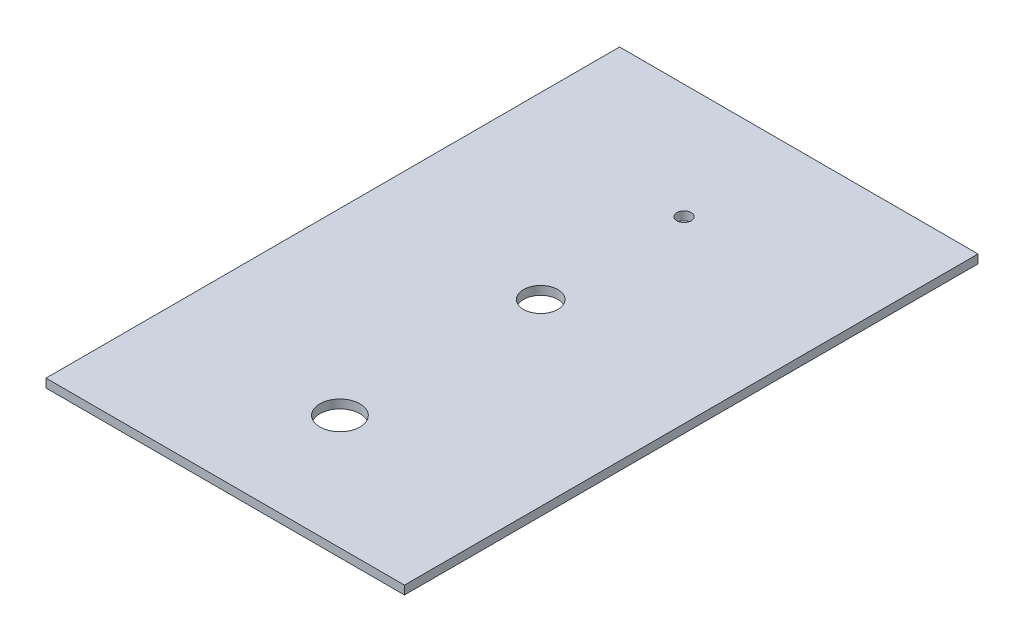
ISO-10303-21;
HEADER;
FILE_DESCRIPTION(('STEP AP214'),'2;1');
FILE_NAME('part.step','',(''),(''),'','','');
FILE_SCHEMA(('AUTOMOTIVE_DESIGN { 1 0 10303 214 1 1 1 1 }'));
ENDSEC;
DATA;
#1=APPLICATION_CONTEXT('core data for automotive mechanical design processes');
#2=APPLICATION_PROTOCOL_DEFINITION('international standard','automotive_design',2000,#1);
#3=PRODUCT_CONTEXT('',#1,'mechanical');
#4=PRODUCT('Part','Part','',(#3));
#5=PRODUCT_RELATED_PRODUCT_CATEGORY('part','',(#4));
#6=PRODUCT_DEFINITION_FORMATION('','',#4);
#7=PRODUCT_DEFINITION_CONTEXT('part definition',#1,'design');
#8=PRODUCT_DEFINITION('design','',#6,#7);
#9=PRODUCT_DEFINITION_SHAPE('','',#8);
#10=(LENGTH_UNIT() NAMED_UNIT(*) SI_UNIT(.MILLI.,.METRE.));
#11=(NAMED_UNIT(*) PLANE_ANGLE_UNIT() SI_UNIT($,.RADIAN.));
#12=(NAMED_UNIT(*) SI_UNIT($,.STERADIAN.) SOLID_ANGLE_UNIT());
#13=UNCERTAINTY_MEASURE_WITH_UNIT(LENGTH_MEASURE(1.E-05),#10,'distance_accuracy_value','');
#14=(GEOMETRIC_REPRESENTATION_CONTEXT(3) GLOBAL_UNCERTAINTY_ASSIGNED_CONTEXT((#13)) GLOBAL_UNIT_ASSIGNED_CONTEXT((#10,
#11,#12)) REPRESENTATION_CONTEXT('',''));
#15=CARTESIAN_POINT('',(0.,0.,0.));
#16=DIRECTION('',(0.,0.,1.));
#17=DIRECTION('',(1.,0.,0.));
#18=AXIS2_PLACEMENT_3D('',#15,#16,#17);
#19=CARTESIAN_POINT('',(62.5,3.,100.));
#20=DIRECTION('',(-1.,0.,0.));
#21=DIRECTION('',(0.,0.,1.));
#22=AXIS2_PLACEMENT_3D('',#19,#20,#21);
#23=PLANE('',#22);
#24=DIRECTION('',(0.,0.,-1.));
#25=VECTOR('',#24,1.);
#26=CARTESIAN_POINT('',(62.5,0.,100.));
#27=LINE('',#26,#25);
#28=CARTESIAN_POINT('',(62.5,0.,100.));
#29=VERTEX_POINT('',#28);
#30=CARTESIAN_POINT('',(62.5,0.,-100.));
#31=VERTEX_POINT('',#30);
#32=EDGE_CURVE('E106',#29,#31,#27,.T.);
#33=ORIENTED_EDGE('',*,*,#32,.T.);
#34=DIRECTION('',(0.,-1.,0.));
#35=VECTOR('',#34,1.);
#36=CARTESIAN_POINT('',(62.5,3.,-100.));
#37=LINE('',#36,#35);
#38=CARTESIAN_POINT('',(62.5,3.,-100.));
#39=VERTEX_POINT('',#38);
#40=EDGE_CURVE('E11',#39,#31,#37,.T.);
#41=ORIENTED_EDGE('',*,*,#40,.F.);
#42=DIRECTION('',(0.,0.,-1.));
#43=VECTOR('',#42,1.);
#44=CARTESIAN_POINT('',(62.5,3.,100.));
#45=LINE('',#44,#43);
#46=CARTESIAN_POINT('',(62.5,3.,100.));
#47=VERTEX_POINT('',#46);
#48=EDGE_CURVE('E90',#47,#39,#45,.T.);
#49=ORIENTED_EDGE('',*,*,#48,.F.);
#50=DIRECTION('',(0.,-1.,0.));
#51=VECTOR('',#50,1.);
#52=CARTESIAN_POINT('',(62.5,3.,100.));
#53=LINE('',#52,#51);
#54=EDGE_CURVE('E102',#47,#29,#53,.T.);
#55=ORIENTED_EDGE('',*,*,#54,.T.);
#56=EDGE_LOOP('',(#33,#41,#49,#55));
#57=FACE_BOUND('',#56,.T.);
#58=ADVANCED_FACE('F38',(#57),#23,.F.);
#59=CARTESIAN_POINT('',(-62.5,3.,-100.));
#60=DIRECTION('',(0.,0.,1.));
#61=DIRECTION('',(1.,0.,0.));
#62=AXIS2_PLACEMENT_3D('',#59,#60,#61);
#63=PLANE('',#62);
#64=DIRECTION('',(-1.,0.,0.));
#65=VECTOR('',#64,1.);
#66=CARTESIAN_POINT('',(-62.5,0.,-100.));
#67=LINE('',#66,#65);
#68=CARTESIAN_POINT('',(-62.5,0.,-100.));
#69=VERTEX_POINT('',#68);
#70=EDGE_CURVE('E95',#31,#69,#67,.T.);
#71=ORIENTED_EDGE('',*,*,#70,.T.);
#72=DIRECTION('',(0.,-1.,0.));
#73=VECTOR('',#72,1.);
#74=CARTESIAN_POINT('',(-62.5,3.,-100.));
#75=LINE('',#74,#73);
#76=CARTESIAN_POINT('',(-62.5,3.,-100.));
#77=VERTEX_POINT('',#76);
#78=EDGE_CURVE('E47',#77,#69,#75,.T.);
#79=ORIENTED_EDGE('',*,*,#78,.F.);
#80=DIRECTION('',(-1.,0.,0.));
#81=VECTOR('',#80,1.);
#82=CARTESIAN_POINT('',(-62.5,3.,-100.));
#83=LINE('',#82,#81);
#84=EDGE_CURVE('E85',#39,#77,#83,.T.);
#85=ORIENTED_EDGE('',*,*,#84,.F.);
#86=ORIENTED_EDGE('',*,*,#40,.T.);
#87=EDGE_LOOP('',(#71,#79,#85,#86));
#88=FACE_BOUND('',#87,.T.);
#89=ADVANCED_FACE('F94',(#88),#63,.F.);
#90=CARTESIAN_POINT('',(-62.5,3.,100.));
#91=DIRECTION('',(1.,0.,0.));
#92=DIRECTION('',(0.,0.,-1.));
#93=AXIS2_PLACEMENT_3D('',#90,#91,#92);
#94=PLANE('',#93);
#95=DIRECTION('',(0.,0.,1.));
#96=VECTOR('',#95,1.);
#97=CARTESIAN_POINT('',(-62.5,0.,100.));
#98=LINE('',#97,#96);
#99=CARTESIAN_POINT('',(-62.5,0.,100.));
#100=VERTEX_POINT('',#99);
#101=EDGE_CURVE('E72',#69,#100,#98,.T.);
#102=ORIENTED_EDGE('',*,*,#101,.T.);
#103=DIRECTION('',(0.,-1.,0.));
#104=VECTOR('',#103,1.);
#105=CARTESIAN_POINT('',(-62.5,3.,100.));
#106=LINE('',#105,#104);
#107=CARTESIAN_POINT('',(-62.5,3.,100.));
#108=VERTEX_POINT('',#107);
#109=EDGE_CURVE('E97',#108,#100,#106,.T.);
#110=ORIENTED_EDGE('',*,*,#109,.F.);
#111=DIRECTION('',(0.,0.,1.));
#112=VECTOR('',#111,1.);
#113=CARTESIAN_POINT('',(-62.5,3.,100.));
#114=LINE('',#113,#112);
#115=EDGE_CURVE('E88',#77,#108,#114,.T.);
#116=ORIENTED_EDGE('',*,*,#115,.F.);
#117=ORIENTED_EDGE('',*,*,#78,.T.);
#118=EDGE_LOOP('',(#102,#110,#116,#117));
#119=FACE_BOUND('',#118,.T.);
#120=ADVANCED_FACE('F98',(#119),#94,.F.);
#121=CARTESIAN_POINT('',(-62.5,3.,100.));
#122=DIRECTION('',(0.,0.,-1.));
#123=DIRECTION('',(-1.,0.,0.));
#124=AXIS2_PLACEMENT_3D('',#121,#122,#123);
#125=PLANE('',#124);
#126=DIRECTION('',(1.,0.,0.));
#127=VECTOR('',#126,1.);
#128=CARTESIAN_POINT('',(-62.5,0.,100.));
#129=LINE('',#128,#127);
#130=EDGE_CURVE('E78',#100,#29,#129,.T.);
#131=ORIENTED_EDGE('',*,*,#130,.T.);
#132=ORIENTED_EDGE('',*,*,#54,.F.);
#133=DIRECTION('',(1.,0.,0.));
#134=VECTOR('',#133,1.);
#135=CARTESIAN_POINT('',(-62.5,3.,100.));
#136=LINE('',#135,#134);
#137=EDGE_CURVE('E55',#108,#47,#136,.T.);
#138=ORIENTED_EDGE('',*,*,#137,.F.);
#139=ORIENTED_EDGE('',*,*,#109,.T.);
#140=EDGE_LOOP('',(#131,#132,#138,#139));
#141=FACE_BOUND('',#140,.T.);
#142=ADVANCED_FACE('F120',(#141),#125,.F.);
#143=CARTESIAN_POINT('',(0.,3.,0.));
#144=DIRECTION('',(0.,-1.,0.));
#145=DIRECTION('',(0.,0.,-1.));
#146=AXIS2_PLACEMENT_3D('',#143,#144,#145);
#147=PLANE('',#146);
#148=CARTESIAN_POINT('',(0.,3.,-60.));
#149=DIRECTION('',(0.,1.,0.));
#150=DIRECTION('',(0.,0.,1.));
#151=AXIS2_PLACEMENT_3D('',#148,#149,#150);
#152=CIRCLE('',#151,2.5);
#153=CARTESIAN_POINT('',(0.,3.,-57.5));
#154=VERTEX_POINT('',#153);
#155=EDGE_CURVE('E110',#154,#154,#152,.T.);
#156=ORIENTED_EDGE('',*,*,#155,.F.);
#157=EDGE_LOOP('',(#156));
#158=FACE_BOUND('',#157,.T.);
#159=CARTESIAN_POINT('',(0.,3.,60.));
#160=DIRECTION('',(0.,1.,0.));
#161=DIRECTION('',(0.,0.,1.));
#162=AXIS2_PLACEMENT_3D('',#159,#160,#161);
#163=CIRCLE('',#162,7.);
#164=CARTESIAN_POINT('',(0.,3.,67.));
#165=VERTEX_POINT('',#164);
#166=EDGE_CURVE('E139',#165,#165,#163,.T.);
#167=ORIENTED_EDGE('',*,*,#166,.F.);
#168=EDGE_LOOP('',(#167));
#169=FACE_BOUND('',#168,.T.);
#170=CARTESIAN_POINT('',(0.,3.,-10.));
#171=DIRECTION('',(0.,1.,0.));
#172=DIRECTION('',(0.,0.,1.));
#173=AXIS2_PLACEMENT_3D('',#170,#171,#172);
#174=CIRCLE('',#173,6.);
#175=CARTESIAN_POINT('',(0.,3.,-4.));
#176=VERTEX_POINT('',#175);
#177=EDGE_CURVE('E131',#176,#176,#174,.T.);
#178=ORIENTED_EDGE('',*,*,#177,.F.);
#179=EDGE_LOOP('',(#178));
#180=FACE_BOUND('',#179,.T.);
#181=ORIENTED_EDGE('',*,*,#48,.T.);
#182=ORIENTED_EDGE('',*,*,#84,.T.);
#183=ORIENTED_EDGE('',*,*,#115,.T.);
#184=ORIENTED_EDGE('',*,*,#137,.T.);
#185=EDGE_LOOP('',(#181,#182,#183,#184));
#186=FACE_BOUND('',#185,.T.);
#187=ADVANCED_FACE('F86',(#158,#169,#180,#186),#147,.F.);
#188=CARTESIAN_POINT('',(0.,0.,0.));
#189=DIRECTION('',(0.,-1.,0.));
#190=DIRECTION('',(0.,0.,-1.));
#191=AXIS2_PLACEMENT_3D('',#188,#189,#190);
#192=PLANE('',#191);
#193=CARTESIAN_POINT('',(0.,0.,-60.));
#194=DIRECTION('',(0.,-1.,0.));
#195=DIRECTION('',(0.,0.,-1.));
#196=AXIS2_PLACEMENT_3D('',#193,#194,#195);
#197=CIRCLE('',#196,2.5);
#198=CARTESIAN_POINT('',(0.,0.,-57.5));
#199=VERTEX_POINT('',#198);
#200=EDGE_CURVE('E143',#199,#199,#197,.F.);
#201=ORIENTED_EDGE('',*,*,#200,.T.);
#202=EDGE_LOOP('',(#201));
#203=FACE_BOUND('',#202,.T.);
#204=CARTESIAN_POINT('',(0.,0.,60.));
#205=DIRECTION('',(0.,-1.,0.));
#206=DIRECTION('',(0.,0.,-1.));
#207=AXIS2_PLACEMENT_3D('',#204,#205,#206);
#208=CIRCLE('',#207,7.);
#209=CARTESIAN_POINT('',(0.,0.,67.));
#210=VERTEX_POINT('',#209);
#211=EDGE_CURVE('E135',#210,#210,#208,.F.);
#212=ORIENTED_EDGE('',*,*,#211,.T.);
#213=EDGE_LOOP('',(#212));
#214=FACE_BOUND('',#213,.T.);
#215=CARTESIAN_POINT('',(0.,0.,-10.));
#216=DIRECTION('',(0.,-1.,0.));
#217=DIRECTION('',(0.,0.,-1.));
#218=AXIS2_PLACEMENT_3D('',#215,#216,#217);
#219=CIRCLE('',#218,6.);
#220=CARTESIAN_POINT('',(0.,0.,-4.));
#221=VERTEX_POINT('',#220);
#222=EDGE_CURVE('E127',#221,#221,#219,.F.);
#223=ORIENTED_EDGE('',*,*,#222,.T.);
#224=EDGE_LOOP('',(#223));
#225=FACE_BOUND('',#224,.T.);
#226=ORIENTED_EDGE('',*,*,#32,.F.);
#227=ORIENTED_EDGE('',*,*,#130,.F.);
#228=ORIENTED_EDGE('',*,*,#101,.F.);
#229=ORIENTED_EDGE('',*,*,#70,.F.);
#230=EDGE_LOOP('',(#226,#227,#228,#229));
#231=FACE_BOUND('',#230,.T.);
#232=ADVANCED_FACE('F123',(#203,#214,#225,#231),#192,.T.);
#233=CARTESIAN_POINT('',(0.,-0.00100000000000013,-10.));
#234=DIRECTION('',(0.,1.,0.));
#235=DIRECTION('',(0.,0.,1.));
#236=AXIS2_PLACEMENT_3D('',#233,#234,#235);
#237=CYLINDRICAL_SURFACE('',#236,6.);
#238=CARTESIAN_POINT('',(0.,0.,-4.));
#239=CARTESIAN_POINT('',(0.,0.03125,-4.));
#240=CARTESIAN_POINT('',(0.,0.0625,-4.));
#241=CARTESIAN_POINT('',(0.,0.125,-4.));
#242=CARTESIAN_POINT('',(0.,0.15625,-4.));
#243=CARTESIAN_POINT('',(0.,0.21875,-4.));
#244=CARTESIAN_POINT('',(0.,0.25,-4.));
#245=CARTESIAN_POINT('',(0.,0.3125,-4.));
#246=CARTESIAN_POINT('',(0.,0.34375,-4.));
#247=CARTESIAN_POINT('',(0.,0.40625,-4.));
#248=CARTESIAN_POINT('',(0.,0.4375,-4.));
#249=CARTESIAN_POINT('',(0.,0.5,-4.));
#250=CARTESIAN_POINT('',(0.,0.53125,-4.));
#251=CARTESIAN_POINT('',(0.,0.59375,-4.));
#252=CARTESIAN_POINT('',(0.,0.625,-4.));
#253=CARTESIAN_POINT('',(0.,0.6875,-4.));
#254=CARTESIAN_POINT('',(0.,0.71875,-4.));
#255=CARTESIAN_POINT('',(0.,0.78125,-4.));
#256=CARTESIAN_POINT('',(0.,0.8125,-4.));
#257=CARTESIAN_POINT('',(0.,0.875,-4.));
#258=CARTESIAN_POINT('',(0.,0.90625,-4.));
#259=CARTESIAN_POINT('',(0.,0.96875,-4.));
#260=CARTESIAN_POINT('',(0.,1.,-4.));
#261=CARTESIAN_POINT('',(0.,1.0625,-4.));
#262=CARTESIAN_POINT('',(0.,1.09375,-4.));
#263=CARTESIAN_POINT('',(0.,1.15625,-4.));
#264=CARTESIAN_POINT('',(0.,1.1875,-4.));
#265=CARTESIAN_POINT('',(0.,1.25,-4.));
#266=CARTESIAN_POINT('',(0.,1.28125,-4.));
#267=CARTESIAN_POINT('',(0.,1.34375,-4.));
#268=CARTESIAN_POINT('',(0.,1.375,-4.));
#269=CARTESIAN_POINT('',(0.,1.4375,-4.));
#270=CARTESIAN_POINT('',(0.,1.46875,-4.));
#271=CARTESIAN_POINT('',(0.,1.53125,-4.));
#272=CARTESIAN_POINT('',(0.,1.5625,-4.));
#273=CARTESIAN_POINT('',(0.,1.625,-4.));
#274=CARTESIAN_POINT('',(0.,1.65625,-4.));
#275=CARTESIAN_POINT('',(0.,1.71875,-4.));
#276=CARTESIAN_POINT('',(0.,1.75,-4.));
#277=CARTESIAN_POINT('',(0.,1.8125,-4.));
#278=CARTESIAN_POINT('',(0.,1.84375,-4.));
#279=CARTESIAN_POINT('',(0.,1.90625,-4.));
#280=CARTESIAN_POINT('',(0.,1.9375,-4.));
#281=CARTESIAN_POINT('',(0.,2.,-4.));
#282=CARTESIAN_POINT('',(0.,2.03125,-4.));
#283=CARTESIAN_POINT('',(0.,2.09375,-4.));
#284=CARTESIAN_POINT('',(0.,2.125,-4.));
#285=CARTESIAN_POINT('',(0.,2.1875,-4.));
#286=CARTESIAN_POINT('',(0.,2.21875,-4.));
#287=CARTESIAN_POINT('',(0.,2.28125,-4.));
#288=CARTESIAN_POINT('',(0.,2.3125,-4.));
#289=CARTESIAN_POINT('',(0.,2.375,-4.));
#290=CARTESIAN_POINT('',(0.,2.40625,-4.));
#291=CARTESIAN_POINT('',(0.,2.46875,-4.));
#292=CARTESIAN_POINT('',(0.,2.5,-4.));
#293=CARTESIAN_POINT('',(0.,2.5625,-4.));
#294=CARTESIAN_POINT('',(0.,2.59375,-4.));
#295=CARTESIAN_POINT('',(0.,2.65625,-4.));
#296=CARTESIAN_POINT('',(0.,2.6875,-4.));
#297=CARTESIAN_POINT('',(0.,2.75,-4.));
#298=CARTESIAN_POINT('',(0.,2.78125,-4.));
#299=CARTESIAN_POINT('',(0.,2.84375,-4.));
#300=CARTESIAN_POINT('',(0.,2.875,-4.));
#301=CARTESIAN_POINT('',(0.,2.9375,-4.));
#302=CARTESIAN_POINT('',(0.,2.96875,-4.));
#303=CARTESIAN_POINT('',(0.,3.,-4.));
#304=B_SPLINE_CURVE_WITH_KNOTS('',3,(#238,#239,#240,#241,#242,#243,#244,#245,#246,#247,#248,
#249,#250,#251,#252,#253,#254,#255,#256,#257,#258,#259,#260,#261,#262,#263,#264,#265,#266,#267,
#268,#269,#270,#271,#272,#273,#274,#275,#276,#277,#278,#279,#280,#281,#282,#283,#284,#285,#286,
#287,#288,#289,#290,#291,#292,#293,#294,#295,#296,#297,#298,#299,#300,#301,#302,#303),
.UNSPECIFIED.,.F.,.F.,(4,2,2,2,2,2,2,2,2,2,2,2,2,2,2,2,2,2,2,2,2,2,2,2,2,2,2,2,2,2,2,2,4),(0.,
0.09375,0.1875,0.28125,0.375,0.46875,0.5625,0.65625,0.75,0.84375,0.9375,1.03125,1.125,1.21875,
1.3125,1.40625,1.5,1.59375,1.6875,1.78125,1.875,1.96875,2.0625,2.15625,2.25,2.34375,2.4375,
2.53125,2.625,2.71875,2.8125,2.90625,3.),.UNSPECIFIED.);
#305=EDGE_CURVE('BSEAM160',#221,#176,#304,.T.);
#306=ORIENTED_EDGE('',*,*,#222,.F.);
#307=ORIENTED_EDGE('',*,*,#177,.T.);
#308=ORIENTED_EDGE('',*,*,#305,.T.);
#309=ORIENTED_EDGE('',*,*,#305,.F.);
#310=EDGE_LOOP('',(#306,#308,#307,#309));
#311=FACE_BOUND('',#310,.T.);
#312=ADVANCED_FACE('F160',(#311),#237,.F.);
#313=CARTESIAN_POINT('',(0.,-0.00100000000000013,60.));
#314=DIRECTION('',(0.,1.,0.));
#315=DIRECTION('',(0.,0.,1.));
#316=AXIS2_PLACEMENT_3D('',#313,#314,#315);
#317=CYLINDRICAL_SURFACE('',#316,7.);
#318=CARTESIAN_POINT('',(0.,0.,67.));
#319=CARTESIAN_POINT('',(0.,0.03125,67.));
#320=CARTESIAN_POINT('',(0.,0.0625,67.));
#321=CARTESIAN_POINT('',(0.,0.125,67.));
#322=CARTESIAN_POINT('',(0.,0.15625,67.));
#323=CARTESIAN_POINT('',(0.,0.21875,67.));
#324=CARTESIAN_POINT('',(0.,0.25,67.));
#325=CARTESIAN_POINT('',(0.,0.3125,67.));
#326=CARTESIAN_POINT('',(0.,0.34375,67.));
#327=CARTESIAN_POINT('',(0.,0.40625,67.));
#328=CARTESIAN_POINT('',(0.,0.4375,67.));
#329=CARTESIAN_POINT('',(0.,0.5,67.));
#330=CARTESIAN_POINT('',(0.,0.53125,67.));
#331=CARTESIAN_POINT('',(0.,0.59375,67.));
#332=CARTESIAN_POINT('',(0.,0.625,67.));
#333=CARTESIAN_POINT('',(0.,0.6875,67.));
#334=CARTESIAN_POINT('',(0.,0.71875,67.));
#335=CARTESIAN_POINT('',(0.,0.78125,67.));
#336=CARTESIAN_POINT('',(0.,0.8125,67.));
#337=CARTESIAN_POINT('',(0.,0.875,67.));
#338=CARTESIAN_POINT('',(0.,0.90625,67.));
#339=CARTESIAN_POINT('',(0.,0.96875,67.));
#340=CARTESIAN_POINT('',(0.,1.,67.));
#341=CARTESIAN_POINT('',(0.,1.0625,67.));
#342=CARTESIAN_POINT('',(0.,1.09375,67.));
#343=CARTESIAN_POINT('',(0.,1.15625,67.));
#344=CARTESIAN_POINT('',(0.,1.1875,67.));
#345=CARTESIAN_POINT('',(0.,1.25,67.));
#346=CARTESIAN_POINT('',(0.,1.28125,67.));
#347=CARTESIAN_POINT('',(0.,1.34375,67.));
#348=CARTESIAN_POINT('',(0.,1.375,67.));
#349=CARTESIAN_POINT('',(0.,1.4375,67.));
#350=CARTESIAN_POINT('',(0.,1.46875,67.));
#351=CARTESIAN_POINT('',(0.,1.53125,67.));
#352=CARTESIAN_POINT('',(0.,1.5625,67.));
#353=CARTESIAN_POINT('',(0.,1.625,67.));
#354=CARTESIAN_POINT('',(0.,1.65625,67.));
#355=CARTESIAN_POINT('',(0.,1.71875,67.));
#356=CARTESIAN_POINT('',(0.,1.75,67.));
#357=CARTESIAN_POINT('',(0.,1.8125,67.));
#358=CARTESIAN_POINT('',(0.,1.84375,67.));
#359=CARTESIAN_POINT('',(0.,1.90625,67.));
#360=CARTESIAN_POINT('',(0.,1.9375,67.));
#361=CARTESIAN_POINT('',(0.,2.,67.));
#362=CARTESIAN_POINT('',(0.,2.03125,67.));
#363=CARTESIAN_POINT('',(0.,2.09375,67.));
#364=CARTESIAN_POINT('',(0.,2.125,67.));
#365=CARTESIAN_POINT('',(0.,2.1875,67.));
#366=CARTESIAN_POINT('',(0.,2.21875,67.));
#367=CARTESIAN_POINT('',(0.,2.28125,67.));
#368=CARTESIAN_POINT('',(0.,2.3125,67.));
#369=CARTESIAN_POINT('',(0.,2.375,67.));
#370=CARTESIAN_POINT('',(0.,2.40625,67.));
#371=CARTESIAN_POINT('',(0.,2.46875,67.));
#372=CARTESIAN_POINT('',(0.,2.5,67.));
#373=CARTESIAN_POINT('',(0.,2.5625,67.));
#374=CARTESIAN_POINT('',(0.,2.59375,67.));
#375=CARTESIAN_POINT('',(0.,2.65625,67.));
#376=CARTESIAN_POINT('',(0.,2.6875,67.));
#377=CARTESIAN_POINT('',(0.,2.75,67.));
#378=CARTESIAN_POINT('',(0.,2.78125,67.));
#379=CARTESIAN_POINT('',(0.,2.84375,67.));
#380=CARTESIAN_POINT('',(0.,2.875,67.));
#381=CARTESIAN_POINT('',(0.,2.9375,67.));
#382=CARTESIAN_POINT('',(0.,2.96875,67.));
#383=CARTESIAN_POINT('',(0.,3.,67.));
#384=B_SPLINE_CURVE_WITH_KNOTS('',3,(#318,#319,#320,#321,#322,#323,#324,#325,#326,#327,#328,
#329,#330,#331,#332,#333,#334,#335,#336,#337,#338,#339,#340,#341,#342,#343,#344,#345,#346,#347,
#348,#349,#350,#351,#352,#353,#354,#355,#356,#357,#358,#359,#360,#361,#362,#363,#364,#365,#366,
#367,#368,#369,#370,#371,#372,#373,#374,#375,#376,#377,#378,#379,#380,#381,#382,#383),
.UNSPECIFIED.,.F.,.F.,(4,2,2,2,2,2,2,2,2,2,2,2,2,2,2,2,2,2,2,2,2,2,2,2,2,2,2,2,2,2,2,2,4),(0.,
0.09375,0.1875,0.28125,0.375,0.46875,0.5625,0.65625,0.75,0.84375,0.9375,1.03125,1.125,1.21875,
1.3125,1.40625,1.5,1.59375,1.6875,1.78125,1.875,1.96875,2.0625,2.15625,2.25,2.34375,2.4375,
2.53125,2.625,2.71875,2.8125,2.90625,3.),.UNSPECIFIED.);
#385=EDGE_CURVE('BSEAM162',#210,#165,#384,.T.);
#386=ORIENTED_EDGE('',*,*,#211,.F.);
#387=ORIENTED_EDGE('',*,*,#166,.T.);
#388=ORIENTED_EDGE('',*,*,#385,.T.);
#389=ORIENTED_EDGE('',*,*,#385,.F.);
#390=EDGE_LOOP('',(#386,#388,#387,#389));
#391=FACE_BOUND('',#390,.T.);
#392=ADVANCED_FACE('F162',(#391),#317,.F.);
#393=CARTESIAN_POINT('',(0.,-0.00100000000000013,-60.));
#394=DIRECTION('',(0.,1.,0.));
#395=DIRECTION('',(0.,0.,1.));
#396=AXIS2_PLACEMENT_3D('',#393,#394,#395);
#397=CYLINDRICAL_SURFACE('',#396,2.5);
#398=CARTESIAN_POINT('',(0.,0.,-57.5));
#399=CARTESIAN_POINT('',(0.,0.03125,-57.5));
#400=CARTESIAN_POINT('',(0.,0.0625,-57.5));
#401=CARTESIAN_POINT('',(0.,0.125,-57.5));
#402=CARTESIAN_POINT('',(0.,0.15625,-57.5));
#403=CARTESIAN_POINT('',(0.,0.21875,-57.5));
#404=CARTESIAN_POINT('',(0.,0.25,-57.5));
#405=CARTESIAN_POINT('',(0.,0.3125,-57.5));
#406=CARTESIAN_POINT('',(0.,0.34375,-57.5));
#407=CARTESIAN_POINT('',(0.,0.40625,-57.5));
#408=CARTESIAN_POINT('',(0.,0.4375,-57.5));
#409=CARTESIAN_POINT('',(0.,0.5,-57.5));
#410=CARTESIAN_POINT('',(0.,0.53125,-57.5));
#411=CARTESIAN_POINT('',(0.,0.59375,-57.5));
#412=CARTESIAN_POINT('',(0.,0.625,-57.5));
#413=CARTESIAN_POINT('',(0.,0.6875,-57.5));
#414=CARTESIAN_POINT('',(0.,0.71875,-57.5));
#415=CARTESIAN_POINT('',(0.,0.78125,-57.5));
#416=CARTESIAN_POINT('',(0.,0.8125,-57.5));
#417=CARTESIAN_POINT('',(0.,0.875,-57.5));
#418=CARTESIAN_POINT('',(0.,0.90625,-57.5));
#419=CARTESIAN_POINT('',(0.,0.96875,-57.5));
#420=CARTESIAN_POINT('',(0.,1.,-57.5));
#421=CARTESIAN_POINT('',(0.,1.0625,-57.5));
#422=CARTESIAN_POINT('',(0.,1.09375,-57.5));
#423=CARTESIAN_POINT('',(0.,1.15625,-57.5));
#424=CARTESIAN_POINT('',(0.,1.1875,-57.5));
#425=CARTESIAN_POINT('',(0.,1.25,-57.5));
#426=CARTESIAN_POINT('',(0.,1.28125,-57.5));
#427=CARTESIAN_POINT('',(0.,1.34375,-57.5));
#428=CARTESIAN_POINT('',(0.,1.375,-57.5));
#429=CARTESIAN_POINT('',(0.,1.4375,-57.5));
#430=CARTESIAN_POINT('',(0.,1.46875,-57.5));
#431=CARTESIAN_POINT('',(0.,1.53125,-57.5));
#432=CARTESIAN_POINT('',(0.,1.5625,-57.5));
#433=CARTESIAN_POINT('',(0.,1.625,-57.5));
#434=CARTESIAN_POINT('',(0.,1.65625,-57.5));
#435=CARTESIAN_POINT('',(0.,1.71875,-57.5));
#436=CARTESIAN_POINT('',(0.,1.75,-57.5));
#437=CARTESIAN_POINT('',(0.,1.8125,-57.5));
#438=CARTESIAN_POINT('',(0.,1.84375,-57.5));
#439=CARTESIAN_POINT('',(0.,1.90625,-57.5));
#440=CARTESIAN_POINT('',(0.,1.9375,-57.5));
#441=CARTESIAN_POINT('',(0.,2.,-57.5));
#442=CARTESIAN_POINT('',(0.,2.03125,-57.5));
#443=CARTESIAN_POINT('',(0.,2.09375,-57.5));
#444=CARTESIAN_POINT('',(0.,2.125,-57.5));
#445=CARTESIAN_POINT('',(0.,2.1875,-57.5));
#446=CARTESIAN_POINT('',(0.,2.21875,-57.5));
#447=CARTESIAN_POINT('',(0.,2.28125,-57.5));
#448=CARTESIAN_POINT('',(0.,2.3125,-57.5));
#449=CARTESIAN_POINT('',(0.,2.375,-57.5));
#450=CARTESIAN_POINT('',(0.,2.40625,-57.5));
#451=CARTESIAN_POINT('',(0.,2.46875,-57.5));
#452=CARTESIAN_POINT('',(0.,2.5,-57.5));
#453=CARTESIAN_POINT('',(0.,2.5625,-57.5));
#454=CARTESIAN_POINT('',(0.,2.59375,-57.5));
#455=CARTESIAN_POINT('',(0.,2.65625,-57.5));
#456=CARTESIAN_POINT('',(0.,2.6875,-57.5));
#457=CARTESIAN_POINT('',(0.,2.75,-57.5));
#458=CARTESIAN_POINT('',(0.,2.78125,-57.5));
#459=CARTESIAN_POINT('',(0.,2.84375,-57.5));
#460=CARTESIAN_POINT('',(0.,2.875,-57.5));
#461=CARTESIAN_POINT('',(0.,2.9375,-57.5));
#462=CARTESIAN_POINT('',(0.,2.96875,-57.5));
#463=CARTESIAN_POINT('',(0.,3.,-57.5));
#464=B_SPLINE_CURVE_WITH_KNOTS('',3,(#398,#399,#400,#401,#402,#403,#404,#405,#406,#407,#408,
#409,#410,#411,#412,#413,#414,#415,#416,#417,#418,#419,#420,#421,#422,#423,#424,#425,#426,#427,
#428,#429,#430,#431,#432,#433,#434,#435,#436,#437,#438,#439,#440,#441,#442,#443,#444,#445,#446,
#447,#448,#449,#450,#451,#452,#453,#454,#455,#456,#457,#458,#459,#460,#461,#462,#463),
.UNSPECIFIED.,.F.,.F.,(4,2,2,2,2,2,2,2,2,2,2,2,2,2,2,2,2,2,2,2,2,2,2,2,2,2,2,2,2,2,2,2,4),(0.,
0.09375,0.1875,0.28125,0.375,0.46875,0.5625,0.65625,0.75,0.84375,0.9375,1.03125,1.125,1.21875,
1.3125,1.40625,1.5,1.59375,1.6875,1.78125,1.875,1.96875,2.0625,2.15625,2.25,2.34375,2.4375,
2.53125,2.625,2.71875,2.8125,2.90625,3.),.UNSPECIFIED.);
#465=EDGE_CURVE('BSEAM151',#199,#154,#464,.T.);
#466=ORIENTED_EDGE('',*,*,#200,.F.);
#467=ORIENTED_EDGE('',*,*,#155,.T.);
#468=ORIENTED_EDGE('',*,*,#465,.T.);
#469=ORIENTED_EDGE('',*,*,#465,.F.);
#470=EDGE_LOOP('',(#466,#468,#467,#469));
#471=FACE_BOUND('',#470,.T.);
#472=ADVANCED_FACE('F151',(#471),#397,.F.);
#473=CLOSED_SHELL('',(#58,#89,#120,#142,#187,#232,#312,#392,#472));
#474=MANIFOLD_SOLID_BREP('B2',#473);
#475=ADVANCED_BREP_SHAPE_REPRESENTATION('',(#18,#474),#14);
#476=SHAPE_DEFINITION_REPRESENTATION(#9,#475);
ENDSEC;
END-ISO-10303-21;
